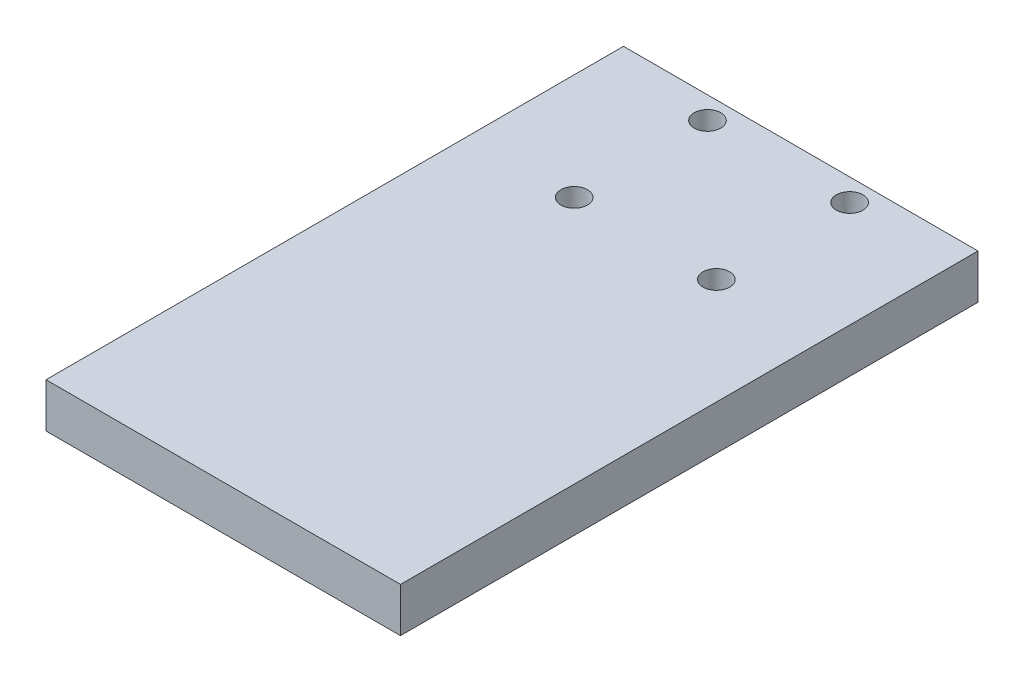
ISO-10303-21;
HEADER;
FILE_DESCRIPTION(('STEP AP214'),'2;1');
FILE_NAME('part.step','',(''),(''),'','','');
FILE_SCHEMA(('AUTOMOTIVE_DESIGN { 1 0 10303 214 1 1 1 1 }'));
ENDSEC;
DATA;
#1=APPLICATION_CONTEXT('core data for automotive mechanical design processes');
#2=APPLICATION_PROTOCOL_DEFINITION('international standard','automotive_design',2000,#1);
#3=PRODUCT_CONTEXT('',#1,'mechanical');
#4=PRODUCT('Part','Part','',(#3));
#5=PRODUCT_RELATED_PRODUCT_CATEGORY('part','',(#4));
#6=PRODUCT_DEFINITION_FORMATION('','',#4);
#7=PRODUCT_DEFINITION_CONTEXT('part definition',#1,'design');
#8=PRODUCT_DEFINITION('design','',#6,#7);
#9=PRODUCT_DEFINITION_SHAPE('','',#8);
#10=(LENGTH_UNIT() NAMED_UNIT(*) SI_UNIT(.MILLI.,.METRE.));
#11=(NAMED_UNIT(*) PLANE_ANGLE_UNIT() SI_UNIT($,.RADIAN.));
#12=(NAMED_UNIT(*) SI_UNIT($,.STERADIAN.) SOLID_ANGLE_UNIT());
#13=UNCERTAINTY_MEASURE_WITH_UNIT(LENGTH_MEASURE(1.E-05),#10,'distance_accuracy_value','');
#14=(GEOMETRIC_REPRESENTATION_CONTEXT(3) GLOBAL_UNCERTAINTY_ASSIGNED_CONTEXT((#13)) GLOBAL_UNIT_ASSIGNED_CONTEXT((#10,
#11,#12)) REPRESENTATION_CONTEXT('',''));
#15=CARTESIAN_POINT('',(0.,0.,0.));
#16=DIRECTION('',(0.,0.,1.));
#17=DIRECTION('',(1.,0.,0.));
#18=AXIS2_PLACEMENT_3D('',#15,#16,#17);
#19=CARTESIAN_POINT('',(0.,5.,0.));
#20=DIRECTION('',(-1.,0.,0.));
#21=DIRECTION('',(0.,0.,1.));
#22=AXIS2_PLACEMENT_3D('',#19,#20,#21);
#23=PLANE('',#22);
#24=DIRECTION('',(0.,0.,-1.));
#25=VECTOR('',#24,1.);
#26=CARTESIAN_POINT('',(0.,0.,0.));
#27=LINE('',#26,#25);
#28=CARTESIAN_POINT('',(0.,0.,45.));
#29=VERTEX_POINT('',#28);
#30=CARTESIAN_POINT('',(0.,0.,-20.));
#31=VERTEX_POINT('',#30);
#32=EDGE_CURVE('E89',#29,#31,#27,.T.);
#33=ORIENTED_EDGE('',*,*,#32,.T.);
#34=DIRECTION('',(0.,-1.,0.));
#35=VECTOR('',#34,1.);
#36=CARTESIAN_POINT('',(0.,5.,-20.));
#37=LINE('',#36,#35);
#38=CARTESIAN_POINT('',(0.,5.,-20.));
#39=VERTEX_POINT('',#38);
#40=EDGE_CURVE('E11',#39,#31,#37,.T.);
#41=ORIENTED_EDGE('',*,*,#40,.F.);
#42=DIRECTION('',(0.,0.,-1.));
#43=VECTOR('',#42,1.);
#44=CARTESIAN_POINT('',(0.,5.,0.));
#45=LINE('',#44,#43);
#46=CARTESIAN_POINT('',(0.,5.,45.));
#47=VERTEX_POINT('',#46);
#48=EDGE_CURVE('E83',#47,#39,#45,.T.);
#49=ORIENTED_EDGE('',*,*,#48,.F.);
#50=DIRECTION('',(0.,1.,0.));
#51=VECTOR('',#50,1.);
#52=CARTESIAN_POINT('',(0.,0.,45.));
#53=LINE('',#52,#51);
#54=EDGE_CURVE('E93',#29,#47,#53,.T.);
#55=ORIENTED_EDGE('',*,*,#54,.F.);
#56=EDGE_LOOP('',(#33,#41,#49,#55));
#57=FACE_BOUND('',#56,.T.);
#58=ADVANCED_FACE('F35',(#57),#23,.F.);
#59=CARTESIAN_POINT('',(0.,5.,-20.));
#60=DIRECTION('',(0.,0.,1.));
#61=DIRECTION('',(1.,0.,0.));
#62=AXIS2_PLACEMENT_3D('',#59,#60,#61);
#63=PLANE('',#62);
#64=DIRECTION('',(-1.,0.,0.));
#65=VECTOR('',#64,1.);
#66=CARTESIAN_POINT('',(0.,0.,-20.));
#67=LINE('',#66,#65);
#68=CARTESIAN_POINT('',(-39.9,0.,-20.));
#69=VERTEX_POINT('',#68);
#70=EDGE_CURVE('E62',#31,#69,#67,.T.);
#71=ORIENTED_EDGE('',*,*,#70,.T.);
#72=DIRECTION('',(0.,-1.,0.));
#73=VECTOR('',#72,1.);
#74=CARTESIAN_POINT('',(-39.9,5.,-20.));
#75=LINE('',#74,#73);
#76=CARTESIAN_POINT('',(-39.9,5.,-20.));
#77=VERTEX_POINT('',#76);
#78=EDGE_CURVE('E43',#77,#69,#75,.T.);
#79=ORIENTED_EDGE('',*,*,#78,.F.);
#80=DIRECTION('',(-1.,0.,0.));
#81=VECTOR('',#80,1.);
#82=CARTESIAN_POINT('',(0.,5.,-20.));
#83=LINE('',#82,#81);
#84=EDGE_CURVE('E51',#39,#77,#83,.T.);
#85=ORIENTED_EDGE('',*,*,#84,.F.);
#86=ORIENTED_EDGE('',*,*,#40,.T.);
#87=EDGE_LOOP('',(#71,#79,#85,#86));
#88=FACE_BOUND('',#87,.T.);
#89=ADVANCED_FACE('F130',(#88),#63,.F.);
#90=CARTESIAN_POINT('',(-39.9,5.,0.));
#91=DIRECTION('',(1.,0.,0.));
#92=DIRECTION('',(0.,0.,-1.));
#93=AXIS2_PLACEMENT_3D('',#90,#91,#92);
#94=PLANE('',#93);
#95=DIRECTION('',(0.,0.,1.));
#96=VECTOR('',#95,1.);
#97=CARTESIAN_POINT('',(-39.9,0.,0.));
#98=LINE('',#97,#96);
#99=CARTESIAN_POINT('',(-39.9,0.,45.));
#100=VERTEX_POINT('',#99);
#101=EDGE_CURVE('E78',#69,#100,#98,.T.);
#102=ORIENTED_EDGE('',*,*,#101,.T.);
#103=DIRECTION('',(0.,-1.,0.));
#104=VECTOR('',#103,1.);
#105=CARTESIAN_POINT('',(-39.9,5.,45.));
#106=LINE('',#105,#104);
#107=CARTESIAN_POINT('',(-39.9,5.,45.));
#108=VERTEX_POINT('',#107);
#109=EDGE_CURVE('E82',#108,#100,#106,.T.);
#110=ORIENTED_EDGE('',*,*,#109,.F.);
#111=DIRECTION('',(0.,0.,1.));
#112=VECTOR('',#111,1.);
#113=CARTESIAN_POINT('',(-39.9,5.,0.));
#114=LINE('',#113,#112);
#115=EDGE_CURVE('E66',#77,#108,#114,.T.);
#116=ORIENTED_EDGE('',*,*,#115,.F.);
#117=ORIENTED_EDGE('',*,*,#78,.T.);
#118=EDGE_LOOP('',(#102,#110,#116,#117));
#119=FACE_BOUND('',#118,.T.);
#120=ADVANCED_FACE('F80',(#119),#94,.F.);
#121=CARTESIAN_POINT('',(0.,5.,0.));
#122=DIRECTION('',(0.,1.,0.));
#123=DIRECTION('',(0.,0.,1.));
#124=AXIS2_PLACEMENT_3D('',#121,#122,#123);
#125=PLANE('',#124);
#126=CARTESIAN_POINT('',(-27.95,5.,-2.5));
#127=DIRECTION('',(0.,1.,0.));
#128=DIRECTION('',(0.,0.,-1.));
#129=AXIS2_PLACEMENT_3D('',#126,#127,#128);
#130=CIRCLE('',#129,1.5);
#131=CARTESIAN_POINT('',(-27.95,5.,-4.));
#132=VERTEX_POINT('',#131);
#133=EDGE_CURVE('E101',#132,#132,#130,.T.);
#134=ORIENTED_EDGE('',*,*,#133,.F.);
#135=EDGE_LOOP('',(#134));
#136=FACE_BOUND('',#135,.T.);
#137=CARTESIAN_POINT('',(-11.95,5.,-2.5));
#138=DIRECTION('',(0.,1.,0.));
#139=DIRECTION('',(0.,0.,-1.));
#140=AXIS2_PLACEMENT_3D('',#137,#138,#139);
#141=CIRCLE('',#140,1.5);
#142=CARTESIAN_POINT('',(-11.95,5.,-4.));
#143=VERTEX_POINT('',#142);
#144=EDGE_CURVE('E112',#143,#143,#141,.T.);
#145=ORIENTED_EDGE('',*,*,#144,.F.);
#146=EDGE_LOOP('',(#145));
#147=FACE_BOUND('',#146,.T.);
#148=CARTESIAN_POINT('',(-11.95,5.,-17.5));
#149=DIRECTION('',(0.,1.,0.));
#150=DIRECTION('',(0.,0.,1.));
#151=AXIS2_PLACEMENT_3D('',#148,#149,#150);
#152=CIRCLE('',#151,1.5);
#153=CARTESIAN_POINT('',(-11.95,5.,-16.));
#154=VERTEX_POINT('',#153);
#155=EDGE_CURVE('E106',#154,#154,#152,.T.);
#156=ORIENTED_EDGE('',*,*,#155,.F.);
#157=EDGE_LOOP('',(#156));
#158=FACE_BOUND('',#157,.T.);
#159=CARTESIAN_POINT('',(-27.95,5.,-17.5));
#160=DIRECTION('',(0.,1.,0.));
#161=DIRECTION('',(0.,0.,1.));
#162=AXIS2_PLACEMENT_3D('',#159,#160,#161);
#163=CIRCLE('',#162,1.5);
#164=CARTESIAN_POINT('',(-27.95,5.,-16.));
#165=VERTEX_POINT('',#164);
#166=EDGE_CURVE('E105',#165,#165,#163,.T.);
#167=ORIENTED_EDGE('',*,*,#166,.F.);
#168=EDGE_LOOP('',(#167));
#169=FACE_BOUND('',#168,.T.);
#170=ORIENTED_EDGE('',*,*,#48,.T.);
#171=ORIENTED_EDGE('',*,*,#84,.T.);
#172=ORIENTED_EDGE('',*,*,#115,.T.);
#173=DIRECTION('',(-1.,0.,0.));
#174=VECTOR('',#173,1.);
#175=CARTESIAN_POINT('',(0.,5.,45.));
#176=LINE('',#175,#174);
#177=EDGE_CURVE('E96',#47,#108,#176,.T.);
#178=ORIENTED_EDGE('',*,*,#177,.F.);
#179=EDGE_LOOP('',(#170,#171,#172,#178));
#180=FACE_BOUND('',#179,.T.);
#181=ADVANCED_FACE('F133',(#136,#147,#158,#169,#180),#125,.T.);
#182=CARTESIAN_POINT('',(0.,0.,0.));
#183=DIRECTION('',(0.,1.,0.));
#184=DIRECTION('',(0.,0.,1.));
#185=AXIS2_PLACEMENT_3D('',#182,#183,#184);
#186=PLANE('',#185);
#187=CARTESIAN_POINT('',(-27.95,0.,-2.5));
#188=DIRECTION('',(0.,1.,0.));
#189=DIRECTION('',(0.,0.,-1.));
#190=AXIS2_PLACEMENT_3D('',#187,#188,#189);
#191=CIRCLE('',#190,1.5);
#192=CARTESIAN_POINT('',(-27.95,0.,-4.));
#193=VERTEX_POINT('',#192);
#194=EDGE_CURVE('E115',#193,#193,#191,.T.);
#195=ORIENTED_EDGE('',*,*,#194,.T.);
#196=EDGE_LOOP('',(#195));
#197=FACE_BOUND('',#196,.T.);
#198=CARTESIAN_POINT('',(-11.95,0.,-2.5));
#199=DIRECTION('',(0.,1.,0.));
#200=DIRECTION('',(0.,0.,-1.));
#201=AXIS2_PLACEMENT_3D('',#198,#199,#200);
#202=CIRCLE('',#201,1.5);
#203=CARTESIAN_POINT('',(-11.95,0.,-4.));
#204=VERTEX_POINT('',#203);
#205=EDGE_CURVE('E109',#204,#204,#202,.T.);
#206=ORIENTED_EDGE('',*,*,#205,.T.);
#207=EDGE_LOOP('',(#206));
#208=FACE_BOUND('',#207,.T.);
#209=CARTESIAN_POINT('',(-11.95,0.,-17.5));
#210=DIRECTION('',(0.,1.,0.));
#211=DIRECTION('',(0.,0.,1.));
#212=AXIS2_PLACEMENT_3D('',#209,#210,#211);
#213=CIRCLE('',#212,1.5);
#214=CARTESIAN_POINT('',(-11.95,0.,-16.));
#215=VERTEX_POINT('',#214);
#216=EDGE_CURVE('E102',#215,#215,#213,.T.);
#217=ORIENTED_EDGE('',*,*,#216,.T.);
#218=EDGE_LOOP('',(#217));
#219=FACE_BOUND('',#218,.T.);
#220=CARTESIAN_POINT('',(-27.95,0.,-17.5));
#221=DIRECTION('',(0.,1.,0.));
#222=DIRECTION('',(0.,0.,1.));
#223=AXIS2_PLACEMENT_3D('',#220,#221,#222);
#224=CIRCLE('',#223,1.5);
#225=CARTESIAN_POINT('',(-27.95,0.,-16.));
#226=VERTEX_POINT('',#225);
#227=EDGE_CURVE('E120',#226,#226,#224,.T.);
#228=ORIENTED_EDGE('',*,*,#227,.T.);
#229=EDGE_LOOP('',(#228));
#230=FACE_BOUND('',#229,.T.);
#231=ORIENTED_EDGE('',*,*,#32,.F.);
#232=DIRECTION('',(1.,0.,0.));
#233=VECTOR('',#232,1.);
#234=CARTESIAN_POINT('',(-39.9,0.,45.));
#235=LINE('',#234,#233);
#236=EDGE_CURVE('E86',#100,#29,#235,.T.);
#237=ORIENTED_EDGE('',*,*,#236,.F.);
#238=ORIENTED_EDGE('',*,*,#101,.F.);
#239=ORIENTED_EDGE('',*,*,#70,.F.);
#240=EDGE_LOOP('',(#231,#237,#238,#239));
#241=FACE_BOUND('',#240,.T.);
#242=ADVANCED_FACE('F87',(#197,#208,#219,#230,#241),#186,.F.);
#243=CARTESIAN_POINT('',(-27.95,0.,-17.5));
#244=DIRECTION('',(0.,1.,0.));
#245=DIRECTION('',(0.,0.,1.));
#246=AXIS2_PLACEMENT_3D('',#243,#244,#245);
#247=CYLINDRICAL_SURFACE('',#246,1.5);
#248=ORIENTED_EDGE('',*,*,#227,.F.);
#249=EDGE_LOOP('',(#248));
#250=FACE_BOUND('',#249,.T.);
#251=ORIENTED_EDGE('',*,*,#166,.T.);
#252=EDGE_LOOP('',(#251));
#253=FACE_BOUND('',#252,.T.);
#254=ADVANCED_FACE('F141',(#250,#253),#247,.F.);
#255=CARTESIAN_POINT('',(-11.95,0.,-17.5));
#256=DIRECTION('',(0.,1.,0.));
#257=DIRECTION('',(0.,0.,1.));
#258=AXIS2_PLACEMENT_3D('',#255,#256,#257);
#259=CYLINDRICAL_SURFACE('',#258,1.5);
#260=ORIENTED_EDGE('',*,*,#216,.F.);
#261=EDGE_LOOP('',(#260));
#262=FACE_BOUND('',#261,.T.);
#263=ORIENTED_EDGE('',*,*,#155,.T.);
#264=EDGE_LOOP('',(#263));
#265=FACE_BOUND('',#264,.T.);
#266=ADVANCED_FACE('F200',(#262,#265),#259,.F.);
#267=CARTESIAN_POINT('',(-11.95,0.,-2.5));
#268=DIRECTION('',(0.,1.,0.));
#269=DIRECTION('',(0.,0.,1.));
#270=AXIS2_PLACEMENT_3D('',#267,#268,#269);
#271=CYLINDRICAL_SURFACE('',#270,1.5);
#272=ORIENTED_EDGE('',*,*,#205,.F.);
#273=EDGE_LOOP('',(#272));
#274=FACE_BOUND('',#273,.T.);
#275=ORIENTED_EDGE('',*,*,#144,.T.);
#276=EDGE_LOOP('',(#275));
#277=FACE_BOUND('',#276,.T.);
#278=ADVANCED_FACE('F192',(#274,#277),#271,.F.);
#279=CARTESIAN_POINT('',(-27.95,0.,-2.5));
#280=DIRECTION('',(0.,1.,0.));
#281=DIRECTION('',(0.,0.,1.));
#282=AXIS2_PLACEMENT_3D('',#279,#280,#281);
#283=CYLINDRICAL_SURFACE('',#282,1.5);
#284=ORIENTED_EDGE('',*,*,#194,.F.);
#285=EDGE_LOOP('',(#284));
#286=FACE_BOUND('',#285,.T.);
#287=ORIENTED_EDGE('',*,*,#133,.T.);
#288=EDGE_LOOP('',(#287));
#289=FACE_BOUND('',#288,.T.);
#290=ADVANCED_FACE('F184',(#286,#289),#283,.F.);
#291=CARTESIAN_POINT('',(0.,0.,45.));
#292=DIRECTION('',(0.,0.,1.));
#293=DIRECTION('',(1.,0.,0.));
#294=AXIS2_PLACEMENT_3D('',#291,#292,#293);
#295=PLANE('',#294);
#296=ORIENTED_EDGE('',*,*,#109,.T.);
#297=ORIENTED_EDGE('',*,*,#236,.T.);
#298=ORIENTED_EDGE('',*,*,#54,.T.);
#299=ORIENTED_EDGE('',*,*,#177,.T.);
#300=EDGE_LOOP('',(#296,#297,#298,#299));
#301=FACE_BOUND('',#300,.T.);
#302=ADVANCED_FACE('F95',(#301),#295,.T.);
#303=CLOSED_SHELL('',(#58,#89,#120,#181,#242,#254,#266,#278,#290,#302));
#304=MANIFOLD_SOLID_BREP('B2',#303);
#305=ADVANCED_BREP_SHAPE_REPRESENTATION('',(#18,#304),#14);
#306=SHAPE_DEFINITION_REPRESENTATION(#9,#305);
ENDSEC;
END-ISO-10303-21;
